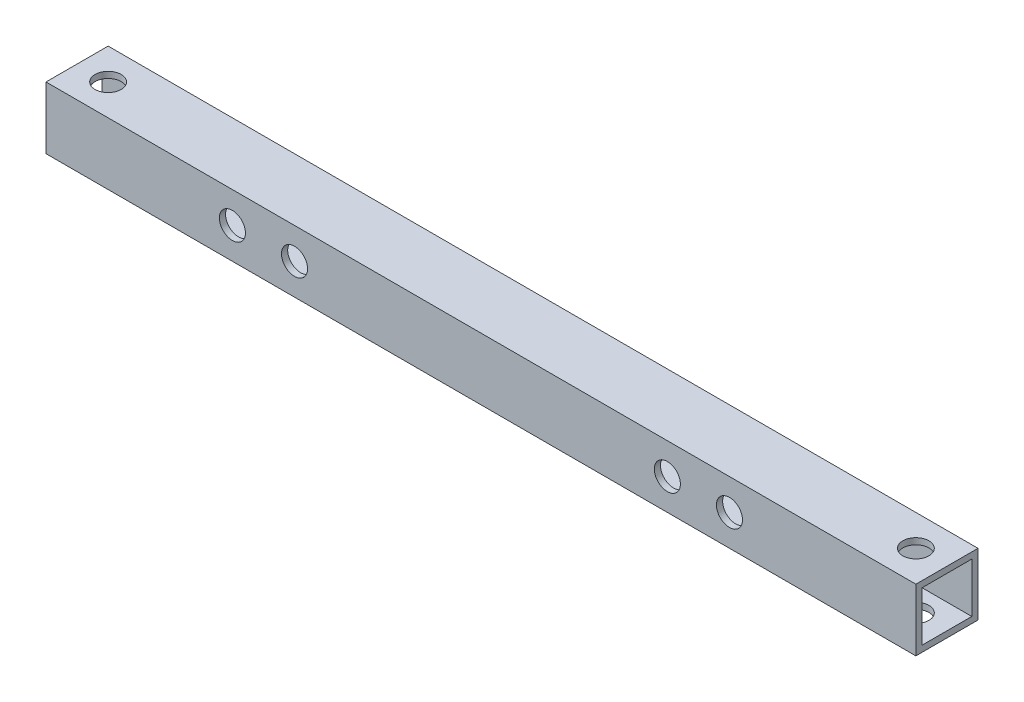
ISO-10303-21;
HEADER;
FILE_DESCRIPTION(('STEP AP214'),'2;1');
FILE_NAME('part.step','',(''),(''),'','','');
FILE_SCHEMA(('AUTOMOTIVE_DESIGN { 1 0 10303 214 1 1 1 1 }'));
ENDSEC;
DATA;
#1=APPLICATION_CONTEXT('core data for automotive mechanical design processes');
#2=APPLICATION_PROTOCOL_DEFINITION('international standard','automotive_design',2000,#1);
#3=PRODUCT_CONTEXT('',#1,'mechanical');
#4=PRODUCT('Part','Part','',(#3));
#5=PRODUCT_RELATED_PRODUCT_CATEGORY('part','',(#4));
#6=PRODUCT_DEFINITION_FORMATION('','',#4);
#7=PRODUCT_DEFINITION_CONTEXT('part definition',#1,'design');
#8=PRODUCT_DEFINITION('design','',#6,#7);
#9=PRODUCT_DEFINITION_SHAPE('','',#8);
#10=(LENGTH_UNIT() NAMED_UNIT(*) SI_UNIT(.MILLI.,.METRE.));
#11=(NAMED_UNIT(*) PLANE_ANGLE_UNIT() SI_UNIT($,.RADIAN.));
#12=(NAMED_UNIT(*) SI_UNIT($,.STERADIAN.) SOLID_ANGLE_UNIT());
#13=UNCERTAINTY_MEASURE_WITH_UNIT(LENGTH_MEASURE(1.E-05),#10,'distance_accuracy_value','');
#14=(GEOMETRIC_REPRESENTATION_CONTEXT(3) GLOBAL_UNCERTAINTY_ASSIGNED_CONTEXT((#13)) GLOBAL_UNIT_ASSIGNED_CONTEXT((#10,
#11,#12)) REPRESENTATION_CONTEXT('',''));
#15=CARTESIAN_POINT('',(0.,0.,0.));
#16=DIRECTION('',(0.,0.,1.));
#17=DIRECTION('',(1.,0.,0.));
#18=AXIS2_PLACEMENT_3D('',#15,#16,#17);
#19=CARTESIAN_POINT('',(140.,0.,0.));
#20=DIRECTION('',(1.,0.,0.));
#21=DIRECTION('',(0.,0.,-1.));
#22=AXIS2_PLACEMENT_3D('',#19,#20,#21);
#23=PLANE('',#22);
#24=DIRECTION('',(0.,1.,0.));
#25=VECTOR('',#24,1.);
#26=CARTESIAN_POINT('',(140.,5.,-5.));
#27=LINE('',#26,#25);
#28=CARTESIAN_POINT('',(140.,-5.,-5.));
#29=VERTEX_POINT('',#28);
#30=CARTESIAN_POINT('',(140.,5.,-5.));
#31=VERTEX_POINT('',#30);
#32=EDGE_CURVE('E163',#29,#31,#27,.T.);
#33=ORIENTED_EDGE('',*,*,#32,.T.);
#34=DIRECTION('',(0.,0.,1.));
#35=VECTOR('',#34,1.);
#36=CARTESIAN_POINT('',(140.,5.,5.));
#37=LINE('',#36,#35);
#38=CARTESIAN_POINT('',(140.,5.,5.));
#39=VERTEX_POINT('',#38);
#40=EDGE_CURVE('E166',#31,#39,#37,.T.);
#41=ORIENTED_EDGE('',*,*,#40,.T.);
#42=DIRECTION('',(0.,-1.,0.));
#43=VECTOR('',#42,1.);
#44=CARTESIAN_POINT('',(140.,5.,5.));
#45=LINE('',#44,#43);
#46=CARTESIAN_POINT('',(140.,-5.,5.));
#47=VERTEX_POINT('',#46);
#48=EDGE_CURVE('E169',#39,#47,#45,.T.);
#49=ORIENTED_EDGE('',*,*,#48,.T.);
#50=DIRECTION('',(0.,0.,-1.));
#51=VECTOR('',#50,1.);
#52=CARTESIAN_POINT('',(140.,-5.,5.));
#53=LINE('',#52,#51);
#54=EDGE_CURVE('E171',#47,#29,#53,.T.);
#55=ORIENTED_EDGE('',*,*,#54,.T.);
#56=EDGE_LOOP('',(#33,#41,#49,#55));
#57=FACE_BOUND('',#56,.T.);
#58=DIRECTION('',(0.,0.,1.));
#59=VECTOR('',#58,1.);
#60=CARTESIAN_POINT('',(140.,4.,5.));
#61=LINE('',#60,#59);
#62=CARTESIAN_POINT('',(140.,4.,-4.));
#63=VERTEX_POINT('',#62);
#64=CARTESIAN_POINT('',(140.,4.,4.));
#65=VERTEX_POINT('',#64);
#66=EDGE_CURVE('E133',#63,#65,#61,.T.);
#67=ORIENTED_EDGE('',*,*,#66,.F.);
#68=DIRECTION('',(0.,1.,0.));
#69=VECTOR('',#68,1.);
#70=CARTESIAN_POINT('',(140.,5.,-4.));
#71=LINE('',#70,#69);
#72=CARTESIAN_POINT('',(140.,-4.,-4.));
#73=VERTEX_POINT('',#72);
#74=EDGE_CURVE('E125',#73,#63,#71,.T.);
#75=ORIENTED_EDGE('',*,*,#74,.F.);
#76=DIRECTION('',(0.,0.,-1.));
#77=VECTOR('',#76,1.);
#78=CARTESIAN_POINT('',(140.,-4.,5.));
#79=LINE('',#78,#77);
#80=CARTESIAN_POINT('',(140.,-4.,4.));
#81=VERTEX_POINT('',#80);
#82=EDGE_CURVE('E147',#81,#73,#79,.T.);
#83=ORIENTED_EDGE('',*,*,#82,.F.);
#84=DIRECTION('',(0.,-1.,0.));
#85=VECTOR('',#84,1.);
#86=CARTESIAN_POINT('',(140.,5.,4.));
#87=LINE('',#86,#85);
#88=EDGE_CURVE('E145',#65,#81,#87,.T.);
#89=ORIENTED_EDGE('',*,*,#88,.F.);
#90=EDGE_LOOP('',(#67,#75,#83,#89));
#91=FACE_BOUND('',#90,.T.);
#92=ADVANCED_FACE('F58',(#57,#91),#23,.T.);
#93=CARTESIAN_POINT('',(0.,0.,0.));
#94=DIRECTION('',(1.,0.,0.));
#95=DIRECTION('',(0.,0.,-1.));
#96=AXIS2_PLACEMENT_3D('',#93,#94,#95);
#97=PLANE('',#96);
#98=DIRECTION('',(0.,1.,0.));
#99=VECTOR('',#98,1.);
#100=CARTESIAN_POINT('',(0.,5.,-5.));
#101=LINE('',#100,#99);
#102=CARTESIAN_POINT('',(0.,-5.,-5.));
#103=VERTEX_POINT('',#102);
#104=CARTESIAN_POINT('',(0.,5.,-5.));
#105=VERTEX_POINT('',#104);
#106=EDGE_CURVE('E141',#103,#105,#101,.T.);
#107=ORIENTED_EDGE('',*,*,#106,.F.);
#108=DIRECTION('',(0.,0.,-1.));
#109=VECTOR('',#108,1.);
#110=CARTESIAN_POINT('',(0.,-5.,5.));
#111=LINE('',#110,#109);
#112=CARTESIAN_POINT('',(0.,-5.,5.));
#113=VERTEX_POINT('',#112);
#114=EDGE_CURVE('E167',#113,#103,#111,.T.);
#115=ORIENTED_EDGE('',*,*,#114,.F.);
#116=DIRECTION('',(0.,-1.,0.));
#117=VECTOR('',#116,1.);
#118=CARTESIAN_POINT('',(0.,5.,5.));
#119=LINE('',#118,#117);
#120=CARTESIAN_POINT('',(0.,5.,5.));
#121=VERTEX_POINT('',#120);
#122=EDGE_CURVE('E178',#121,#113,#119,.T.);
#123=ORIENTED_EDGE('',*,*,#122,.F.);
#124=DIRECTION('',(0.,0.,1.));
#125=VECTOR('',#124,1.);
#126=CARTESIAN_POINT('',(0.,5.,5.));
#127=LINE('',#126,#125);
#128=EDGE_CURVE('E176',#105,#121,#127,.T.);
#129=ORIENTED_EDGE('',*,*,#128,.F.);
#130=EDGE_LOOP('',(#107,#115,#123,#129));
#131=FACE_BOUND('',#130,.T.);
#132=DIRECTION('',(0.,1.,0.));
#133=VECTOR('',#132,1.);
#134=CARTESIAN_POINT('',(0.,5.,-4.));
#135=LINE('',#134,#133);
#136=CARTESIAN_POINT('',(0.,-4.,-4.));
#137=VERTEX_POINT('',#136);
#138=CARTESIAN_POINT('',(0.,4.,-4.));
#139=VERTEX_POINT('',#138);
#140=EDGE_CURVE('E83',#137,#139,#135,.T.);
#141=ORIENTED_EDGE('',*,*,#140,.T.);
#142=DIRECTION('',(0.,0.,1.));
#143=VECTOR('',#142,1.);
#144=CARTESIAN_POINT('',(0.,4.,5.));
#145=LINE('',#144,#143);
#146=CARTESIAN_POINT('',(0.,4.,4.));
#147=VERTEX_POINT('',#146);
#148=EDGE_CURVE('E140',#139,#147,#145,.T.);
#149=ORIENTED_EDGE('',*,*,#148,.T.);
#150=DIRECTION('',(0.,-1.,0.));
#151=VECTOR('',#150,1.);
#152=CARTESIAN_POINT('',(0.,5.,4.));
#153=LINE('',#152,#151);
#154=CARTESIAN_POINT('',(0.,-4.,4.));
#155=VERTEX_POINT('',#154);
#156=EDGE_CURVE('E155',#147,#155,#153,.T.);
#157=ORIENTED_EDGE('',*,*,#156,.T.);
#158=DIRECTION('',(0.,0.,-1.));
#159=VECTOR('',#158,1.);
#160=CARTESIAN_POINT('',(0.,-4.,5.));
#161=LINE('',#160,#159);
#162=EDGE_CURVE('E134',#155,#137,#161,.T.);
#163=ORIENTED_EDGE('',*,*,#162,.T.);
#164=EDGE_LOOP('',(#141,#149,#157,#163));
#165=FACE_BOUND('',#164,.T.);
#166=ADVANCED_FACE('F267',(#131,#165),#97,.F.);
#167=CARTESIAN_POINT('',(140.,5.,-5.));
#168=DIRECTION('',(0.,0.,1.));
#169=DIRECTION('',(0.,-1.,0.));
#170=AXIS2_PLACEMENT_3D('',#167,#168,#169);
#171=PLANE('',#170);
#172=CARTESIAN_POINT('',(30.,0.,-5.));
#173=DIRECTION('',(0.,0.,1.));
#174=DIRECTION('',(1.,0.,0.));
#175=AXIS2_PLACEMENT_3D('',#172,#173,#174);
#176=CIRCLE('',#175,2.1);
#177=CARTESIAN_POINT('',(32.1,0.,-5.));
#178=VERTEX_POINT('',#177);
#179=EDGE_CURVE('E307',#178,#178,#176,.T.);
#180=ORIENTED_EDGE('',*,*,#179,.T.);
#181=EDGE_LOOP('',(#180));
#182=FACE_BOUND('',#181,.T.);
#183=CARTESIAN_POINT('',(110.,0.,-5.));
#184=DIRECTION('',(0.,0.,1.));
#185=DIRECTION('',(-1.,0.,0.));
#186=AXIS2_PLACEMENT_3D('',#183,#184,#185);
#187=CIRCLE('',#186,2.09999999999999);
#188=CARTESIAN_POINT('',(107.9,0.,-5.));
#189=VERTEX_POINT('',#188);
#190=EDGE_CURVE('E314',#189,#189,#187,.T.);
#191=ORIENTED_EDGE('',*,*,#190,.T.);
#192=EDGE_LOOP('',(#191));
#193=FACE_BOUND('',#192,.T.);
#194=CARTESIAN_POINT('',(100.,0.,-5.));
#195=DIRECTION('',(0.,0.,1.));
#196=DIRECTION('',(-1.,0.,0.));
#197=AXIS2_PLACEMENT_3D('',#194,#195,#196);
#198=CIRCLE('',#197,2.09999999999999);
#199=CARTESIAN_POINT('',(97.9,0.,-5.));
#200=VERTEX_POINT('',#199);
#201=EDGE_CURVE('E315',#200,#200,#198,.T.);
#202=ORIENTED_EDGE('',*,*,#201,.T.);
#203=EDGE_LOOP('',(#202));
#204=FACE_BOUND('',#203,.T.);
#205=CARTESIAN_POINT('',(40.,0.,-5.));
#206=DIRECTION('',(0.,0.,1.));
#207=DIRECTION('',(1.,0.,0.));
#208=AXIS2_PLACEMENT_3D('',#205,#206,#207);
#209=CIRCLE('',#208,2.1);
#210=CARTESIAN_POINT('',(42.1,0.,-5.));
#211=VERTEX_POINT('',#210);
#212=EDGE_CURVE('E200',#211,#211,#209,.T.);
#213=ORIENTED_EDGE('',*,*,#212,.T.);
#214=EDGE_LOOP('',(#213));
#215=FACE_BOUND('',#214,.T.);
#216=ORIENTED_EDGE('',*,*,#106,.T.);
#217=DIRECTION('',(-1.,0.,0.));
#218=VECTOR('',#217,1.);
#219=CARTESIAN_POINT('',(140.,5.,-5.));
#220=LINE('',#219,#218);
#221=EDGE_CURVE('E12',#31,#105,#220,.T.);
#222=ORIENTED_EDGE('',*,*,#221,.F.);
#223=ORIENTED_EDGE('',*,*,#32,.F.);
#224=DIRECTION('',(-1.,0.,0.));
#225=VECTOR('',#224,1.);
#226=CARTESIAN_POINT('',(140.,-5.,-5.));
#227=LINE('',#226,#225);
#228=EDGE_CURVE('E173',#29,#103,#227,.T.);
#229=ORIENTED_EDGE('',*,*,#228,.T.);
#230=EDGE_LOOP('',(#216,#222,#223,#229));
#231=FACE_BOUND('',#230,.T.);
#232=ADVANCED_FACE('F60',(#182,#193,#204,#215,#231),#171,.F.);
#233=CARTESIAN_POINT('',(140.,5.,5.));
#234=DIRECTION('',(0.,-1.,0.));
#235=DIRECTION('',(0.,0.,-1.));
#236=AXIS2_PLACEMENT_3D('',#233,#234,#235);
#237=PLANE('',#236);
#238=CARTESIAN_POINT('',(5.,5.,0.));
#239=DIRECTION('',(0.,1.,0.));
#240=DIRECTION('',(0.,0.,1.));
#241=AXIS2_PLACEMENT_3D('',#238,#239,#240);
#242=CIRCLE('',#241,2.1);
#243=CARTESIAN_POINT('',(5.,5.,2.1));
#244=VERTEX_POINT('',#243);
#245=EDGE_CURVE('E224',#244,#244,#242,.T.);
#246=ORIENTED_EDGE('',*,*,#245,.F.);
#247=EDGE_LOOP('',(#246));
#248=FACE_BOUND('',#247,.T.);
#249=CARTESIAN_POINT('',(135.,5.,0.));
#250=DIRECTION('',(0.,1.,0.));
#251=DIRECTION('',(0.,0.,-1.));
#252=AXIS2_PLACEMENT_3D('',#249,#250,#251);
#253=CIRCLE('',#252,2.10000000000002);
#254=CARTESIAN_POINT('',(135.,5.,-2.10000000000004));
#255=VERTEX_POINT('',#254);
#256=EDGE_CURVE('E221',#255,#255,#253,.T.);
#257=ORIENTED_EDGE('',*,*,#256,.F.);
#258=EDGE_LOOP('',(#257));
#259=FACE_BOUND('',#258,.T.);
#260=ORIENTED_EDGE('',*,*,#128,.T.);
#261=DIRECTION('',(-1.,0.,0.));
#262=VECTOR('',#261,1.);
#263=CARTESIAN_POINT('',(140.,5.,5.));
#264=LINE('',#263,#262);
#265=EDGE_CURVE('E67',#39,#121,#264,.T.);
#266=ORIENTED_EDGE('',*,*,#265,.F.);
#267=ORIENTED_EDGE('',*,*,#40,.F.);
#268=ORIENTED_EDGE('',*,*,#221,.T.);
#269=EDGE_LOOP('',(#260,#266,#267,#268));
#270=FACE_BOUND('',#269,.T.);
#271=ADVANCED_FACE('F253',(#248,#259,#270),#237,.F.);
#272=CARTESIAN_POINT('',(140.,5.,5.));
#273=DIRECTION('',(0.,0.,-1.));
#274=DIRECTION('',(0.,1.,0.));
#275=AXIS2_PLACEMENT_3D('',#272,#273,#274);
#276=PLANE('',#275);
#277=CARTESIAN_POINT('',(30.,0.,5.));
#278=DIRECTION('',(0.,0.,1.));
#279=DIRECTION('',(1.,0.,0.));
#280=AXIS2_PLACEMENT_3D('',#277,#278,#279);
#281=CIRCLE('',#280,2.1);
#282=CARTESIAN_POINT('',(32.1,0.,5.));
#283=VERTEX_POINT('',#282);
#284=EDGE_CURVE('E294',#283,#283,#281,.T.);
#285=ORIENTED_EDGE('',*,*,#284,.F.);
#286=EDGE_LOOP('',(#285));
#287=FACE_BOUND('',#286,.T.);
#288=CARTESIAN_POINT('',(110.,0.,5.));
#289=DIRECTION('',(0.,0.,1.));
#290=DIRECTION('',(-1.,0.,0.));
#291=AXIS2_PLACEMENT_3D('',#288,#289,#290);
#292=CIRCLE('',#291,2.09999999999999);
#293=CARTESIAN_POINT('',(107.9,0.,5.));
#294=VERTEX_POINT('',#293);
#295=EDGE_CURVE('E298',#294,#294,#292,.T.);
#296=ORIENTED_EDGE('',*,*,#295,.F.);
#297=EDGE_LOOP('',(#296));
#298=FACE_BOUND('',#297,.T.);
#299=CARTESIAN_POINT('',(100.,0.,5.));
#300=DIRECTION('',(0.,0.,1.));
#301=DIRECTION('',(-1.,0.,0.));
#302=AXIS2_PLACEMENT_3D('',#299,#300,#301);
#303=CIRCLE('',#302,2.09999999999999);
#304=CARTESIAN_POINT('',(97.9,0.,5.));
#305=VERTEX_POINT('',#304);
#306=EDGE_CURVE('E302',#305,#305,#303,.T.);
#307=ORIENTED_EDGE('',*,*,#306,.F.);
#308=EDGE_LOOP('',(#307));
#309=FACE_BOUND('',#308,.T.);
#310=CARTESIAN_POINT('',(40.,0.,5.));
#311=DIRECTION('',(0.,0.,1.));
#312=DIRECTION('',(1.,0.,0.));
#313=AXIS2_PLACEMENT_3D('',#310,#311,#312);
#314=CIRCLE('',#313,2.1);
#315=CARTESIAN_POINT('',(42.1,0.,5.));
#316=VERTEX_POINT('',#315);
#317=EDGE_CURVE('E305',#316,#316,#314,.T.);
#318=ORIENTED_EDGE('',*,*,#317,.F.);
#319=EDGE_LOOP('',(#318));
#320=FACE_BOUND('',#319,.T.);
#321=ORIENTED_EDGE('',*,*,#122,.T.);
#322=DIRECTION('',(-1.,0.,0.));
#323=VECTOR('',#322,1.);
#324=CARTESIAN_POINT('',(140.,-5.,5.));
#325=LINE('',#324,#323);
#326=EDGE_CURVE('E183',#47,#113,#325,.T.);
#327=ORIENTED_EDGE('',*,*,#326,.F.);
#328=ORIENTED_EDGE('',*,*,#48,.F.);
#329=ORIENTED_EDGE('',*,*,#265,.T.);
#330=EDGE_LOOP('',(#321,#327,#328,#329));
#331=FACE_BOUND('',#330,.T.);
#332=ADVANCED_FACE('F256',(#287,#298,#309,#320,#331),#276,.F.);
#333=CARTESIAN_POINT('',(140.,-5.,5.));
#334=DIRECTION('',(0.,1.,0.));
#335=DIRECTION('',(0.,0.,1.));
#336=AXIS2_PLACEMENT_3D('',#333,#334,#335);
#337=PLANE('',#336);
#338=CARTESIAN_POINT('',(5.,-5.,0.));
#339=DIRECTION('',(0.,1.,0.));
#340=DIRECTION('',(0.,0.,1.));
#341=AXIS2_PLACEMENT_3D('',#338,#339,#340);
#342=CIRCLE('',#341,2.1);
#343=CARTESIAN_POINT('',(5.,-5.,2.1));
#344=VERTEX_POINT('',#343);
#345=EDGE_CURVE('E192',#344,#344,#342,.T.);
#346=ORIENTED_EDGE('',*,*,#345,.T.);
#347=EDGE_LOOP('',(#346));
#348=FACE_BOUND('',#347,.T.);
#349=CARTESIAN_POINT('',(135.,-5.,0.));
#350=DIRECTION('',(0.,1.,0.));
#351=DIRECTION('',(0.,0.,-1.));
#352=AXIS2_PLACEMENT_3D('',#349,#350,#351);
#353=CIRCLE('',#352,2.10000000000002);
#354=CARTESIAN_POINT('',(135.,-5.,-2.10000000000004));
#355=VERTEX_POINT('',#354);
#356=EDGE_CURVE('E227',#355,#355,#353,.T.);
#357=ORIENTED_EDGE('',*,*,#356,.T.);
#358=EDGE_LOOP('',(#357));
#359=FACE_BOUND('',#358,.T.);
#360=ORIENTED_EDGE('',*,*,#114,.T.);
#361=ORIENTED_EDGE('',*,*,#228,.F.);
#362=ORIENTED_EDGE('',*,*,#54,.F.);
#363=ORIENTED_EDGE('',*,*,#326,.T.);
#364=EDGE_LOOP('',(#360,#361,#362,#363));
#365=FACE_BOUND('',#364,.T.);
#366=ADVANCED_FACE('F271',(#348,#359,#365),#337,.F.);
#367=CARTESIAN_POINT('',(140.,5.,-4.));
#368=DIRECTION('',(0.,0.,1.));
#369=DIRECTION('',(0.,-1.,0.));
#370=AXIS2_PLACEMENT_3D('',#367,#368,#369);
#371=PLANE('',#370);
#372=CARTESIAN_POINT('',(30.,0.,-4.));
#373=DIRECTION('',(0.,0.,1.));
#374=DIRECTION('',(0.,-1.,0.));
#375=AXIS2_PLACEMENT_3D('',#372,#373,#374);
#376=CIRCLE('',#375,2.1);
#377=CARTESIAN_POINT('',(30.,-2.1,-4.));
#378=VERTEX_POINT('',#377);
#379=EDGE_CURVE('E218',#378,#378,#376,.T.);
#380=ORIENTED_EDGE('',*,*,#379,.F.);
#381=EDGE_LOOP('',(#380));
#382=FACE_BOUND('',#381,.T.);
#383=CARTESIAN_POINT('',(110.,0.,-4.));
#384=DIRECTION('',(0.,0.,1.));
#385=DIRECTION('',(0.,-1.,0.));
#386=AXIS2_PLACEMENT_3D('',#383,#384,#385);
#387=CIRCLE('',#386,2.09999999999999);
#388=CARTESIAN_POINT('',(110.,-2.09999999999998,-4.));
#389=VERTEX_POINT('',#388);
#390=EDGE_CURVE('E206',#389,#389,#387,.T.);
#391=ORIENTED_EDGE('',*,*,#390,.F.);
#392=EDGE_LOOP('',(#391));
#393=FACE_BOUND('',#392,.T.);
#394=CARTESIAN_POINT('',(100.,0.,-4.));
#395=DIRECTION('',(0.,0.,1.));
#396=DIRECTION('',(0.,-1.,0.));
#397=AXIS2_PLACEMENT_3D('',#394,#395,#396);
#398=CIRCLE('',#397,2.09999999999999);
#399=CARTESIAN_POINT('',(100.,-2.09999999999998,-4.));
#400=VERTEX_POINT('',#399);
#401=EDGE_CURVE('E203',#400,#400,#398,.T.);
#402=ORIENTED_EDGE('',*,*,#401,.F.);
#403=EDGE_LOOP('',(#402));
#404=FACE_BOUND('',#403,.T.);
#405=CARTESIAN_POINT('',(40.,0.,-4.));
#406=DIRECTION('',(0.,0.,1.));
#407=DIRECTION('',(0.,-1.,0.));
#408=AXIS2_PLACEMENT_3D('',#405,#406,#407);
#409=CIRCLE('',#408,2.1);
#410=CARTESIAN_POINT('',(40.,-2.1,-4.));
#411=VERTEX_POINT('',#410);
#412=EDGE_CURVE('E199',#411,#411,#409,.T.);
#413=ORIENTED_EDGE('',*,*,#412,.F.);
#414=EDGE_LOOP('',(#413));
#415=FACE_BOUND('',#414,.T.);
#416=ORIENTED_EDGE('',*,*,#140,.F.);
#417=DIRECTION('',(-1.,0.,0.));
#418=VECTOR('',#417,1.);
#419=CARTESIAN_POINT('',(140.,-4.,-4.));
#420=LINE('',#419,#418);
#421=EDGE_CURVE('E129',#73,#137,#420,.T.);
#422=ORIENTED_EDGE('',*,*,#421,.F.);
#423=ORIENTED_EDGE('',*,*,#74,.T.);
#424=DIRECTION('',(-1.,0.,0.));
#425=VECTOR('',#424,1.);
#426=CARTESIAN_POINT('',(140.,4.,-4.));
#427=LINE('',#426,#425);
#428=EDGE_CURVE('E128',#63,#139,#427,.T.);
#429=ORIENTED_EDGE('',*,*,#428,.T.);
#430=EDGE_LOOP('',(#416,#422,#423,#429));
#431=FACE_BOUND('',#430,.T.);
#432=ADVANCED_FACE('F127',(#382,#393,#404,#415,#431),#371,.T.);
#433=CARTESIAN_POINT('',(140.,4.,5.));
#434=DIRECTION('',(0.,-1.,0.));
#435=DIRECTION('',(0.,0.,-1.));
#436=AXIS2_PLACEMENT_3D('',#433,#434,#435);
#437=PLANE('',#436);
#438=CARTESIAN_POINT('',(5.,4.,0.));
#439=DIRECTION('',(0.,-1.,0.));
#440=DIRECTION('',(0.,0.,-1.));
#441=AXIS2_PLACEMENT_3D('',#438,#439,#440);
#442=CIRCLE('',#441,2.1);
#443=CARTESIAN_POINT('',(5.,4.,-2.1));
#444=VERTEX_POINT('',#443);
#445=EDGE_CURVE('E153',#444,#444,#442,.T.);
#446=ORIENTED_EDGE('',*,*,#445,.F.);
#447=EDGE_LOOP('',(#446));
#448=FACE_BOUND('',#447,.T.);
#449=CARTESIAN_POINT('',(135.,4.,0.));
#450=DIRECTION('',(0.,-1.,0.));
#451=DIRECTION('',(0.,0.,-1.));
#452=AXIS2_PLACEMENT_3D('',#449,#450,#451);
#453=CIRCLE('',#452,2.10000000000002);
#454=CARTESIAN_POINT('',(135.,4.,-2.10000000000004));
#455=VERTEX_POINT('',#454);
#456=EDGE_CURVE('E191',#455,#455,#453,.T.);
#457=ORIENTED_EDGE('',*,*,#456,.F.);
#458=EDGE_LOOP('',(#457));
#459=FACE_BOUND('',#458,.T.);
#460=ORIENTED_EDGE('',*,*,#148,.F.);
#461=ORIENTED_EDGE('',*,*,#428,.F.);
#462=ORIENTED_EDGE('',*,*,#66,.T.);
#463=DIRECTION('',(-1.,0.,0.));
#464=VECTOR('',#463,1.);
#465=CARTESIAN_POINT('',(140.,4.,4.));
#466=LINE('',#465,#464);
#467=EDGE_CURVE('E142',#65,#147,#466,.T.);
#468=ORIENTED_EDGE('',*,*,#467,.T.);
#469=EDGE_LOOP('',(#460,#461,#462,#468));
#470=FACE_BOUND('',#469,.T.);
#471=ADVANCED_FACE('F137',(#448,#459,#470),#437,.T.);
#472=CARTESIAN_POINT('',(140.,5.,4.));
#473=DIRECTION('',(0.,0.,-1.));
#474=DIRECTION('',(0.,1.,0.));
#475=AXIS2_PLACEMENT_3D('',#472,#473,#474);
#476=PLANE('',#475);
#477=CARTESIAN_POINT('',(30.,0.,4.));
#478=DIRECTION('',(0.,0.,-1.));
#479=DIRECTION('',(0.,1.,0.));
#480=AXIS2_PLACEMENT_3D('',#477,#478,#479);
#481=CIRCLE('',#480,2.1);
#482=CARTESIAN_POINT('',(30.,2.1,4.));
#483=VERTEX_POINT('',#482);
#484=EDGE_CURVE('E62',#483,#483,#481,.T.);
#485=ORIENTED_EDGE('',*,*,#484,.F.);
#486=EDGE_LOOP('',(#485));
#487=FACE_BOUND('',#486,.T.);
#488=CARTESIAN_POINT('',(110.,0.,4.));
#489=DIRECTION('',(0.,0.,-1.));
#490=DIRECTION('',(0.,1.,0.));
#491=AXIS2_PLACEMENT_3D('',#488,#489,#490);
#492=CIRCLE('',#491,2.09999999999999);
#493=CARTESIAN_POINT('',(110.,2.1,4.));
#494=VERTEX_POINT('',#493);
#495=EDGE_CURVE('E204',#494,#494,#492,.T.);
#496=ORIENTED_EDGE('',*,*,#495,.F.);
#497=EDGE_LOOP('',(#496));
#498=FACE_BOUND('',#497,.T.);
#499=CARTESIAN_POINT('',(100.,0.,4.));
#500=DIRECTION('',(0.,0.,-1.));
#501=DIRECTION('',(0.,1.,0.));
#502=AXIS2_PLACEMENT_3D('',#499,#500,#501);
#503=CIRCLE('',#502,2.09999999999999);
#504=CARTESIAN_POINT('',(100.,2.1,4.));
#505=VERTEX_POINT('',#504);
#506=EDGE_CURVE('E201',#505,#505,#503,.T.);
#507=ORIENTED_EDGE('',*,*,#506,.F.);
#508=EDGE_LOOP('',(#507));
#509=FACE_BOUND('',#508,.T.);
#510=CARTESIAN_POINT('',(40.,0.,4.));
#511=DIRECTION('',(0.,0.,-1.));
#512=DIRECTION('',(0.,1.,0.));
#513=AXIS2_PLACEMENT_3D('',#510,#511,#512);
#514=CIRCLE('',#513,2.1);
#515=CARTESIAN_POINT('',(40.,2.1,4.));
#516=VERTEX_POINT('',#515);
#517=EDGE_CURVE('E196',#516,#516,#514,.T.);
#518=ORIENTED_EDGE('',*,*,#517,.F.);
#519=EDGE_LOOP('',(#518));
#520=FACE_BOUND('',#519,.T.);
#521=ORIENTED_EDGE('',*,*,#156,.F.);
#522=ORIENTED_EDGE('',*,*,#467,.F.);
#523=ORIENTED_EDGE('',*,*,#88,.T.);
#524=DIRECTION('',(-1.,0.,0.));
#525=VECTOR('',#524,1.);
#526=CARTESIAN_POINT('',(140.,-4.,4.));
#527=LINE('',#526,#525);
#528=EDGE_CURVE('E75',#81,#155,#527,.T.);
#529=ORIENTED_EDGE('',*,*,#528,.T.);
#530=EDGE_LOOP('',(#521,#522,#523,#529));
#531=FACE_BOUND('',#530,.T.);
#532=ADVANCED_FACE('F241',(#487,#498,#509,#520,#531),#476,.T.);
#533=CARTESIAN_POINT('',(140.,-4.,5.));
#534=DIRECTION('',(0.,1.,0.));
#535=DIRECTION('',(0.,0.,1.));
#536=AXIS2_PLACEMENT_3D('',#533,#534,#535);
#537=PLANE('',#536);
#538=CARTESIAN_POINT('',(5.,-4.,0.));
#539=DIRECTION('',(0.,1.,0.));
#540=DIRECTION('',(0.,0.,1.));
#541=AXIS2_PLACEMENT_3D('',#538,#539,#540);
#542=CIRCLE('',#541,2.1);
#543=CARTESIAN_POINT('',(5.,-4.,2.1));
#544=VERTEX_POINT('',#543);
#545=EDGE_CURVE('E193',#544,#544,#542,.T.);
#546=ORIENTED_EDGE('',*,*,#545,.F.);
#547=EDGE_LOOP('',(#546));
#548=FACE_BOUND('',#547,.T.);
#549=CARTESIAN_POINT('',(135.,-4.,0.));
#550=DIRECTION('',(0.,1.,0.));
#551=DIRECTION('',(0.,0.,1.));
#552=AXIS2_PLACEMENT_3D('',#549,#550,#551);
#553=CIRCLE('',#552,2.10000000000002);
#554=CARTESIAN_POINT('',(135.,-4.,2.1));
#555=VERTEX_POINT('',#554);
#556=EDGE_CURVE('E188',#555,#555,#553,.T.);
#557=ORIENTED_EDGE('',*,*,#556,.F.);
#558=EDGE_LOOP('',(#557));
#559=FACE_BOUND('',#558,.T.);
#560=ORIENTED_EDGE('',*,*,#162,.F.);
#561=ORIENTED_EDGE('',*,*,#528,.F.);
#562=ORIENTED_EDGE('',*,*,#82,.T.);
#563=ORIENTED_EDGE('',*,*,#421,.T.);
#564=EDGE_LOOP('',(#560,#561,#562,#563));
#565=FACE_BOUND('',#564,.T.);
#566=ADVANCED_FACE('F356',(#548,#559,#565),#537,.T.);
#567=CARTESIAN_POINT('',(135.,-5.,0.));
#568=DIRECTION('',(0.,1.,0.));
#569=DIRECTION('',(0.,0.,1.));
#570=AXIS2_PLACEMENT_3D('',#567,#568,#569);
#571=CYLINDRICAL_SURFACE('',#570,2.10000000000002);
#572=ORIENTED_EDGE('',*,*,#556,.T.);
#573=EDGE_LOOP('',(#572));
#574=FACE_BOUND('',#573,.T.);
#575=ORIENTED_EDGE('',*,*,#356,.F.);
#576=EDGE_LOOP('',(#575));
#577=FACE_BOUND('',#576,.T.);
#578=ADVANCED_FACE('F250',(#574,#577),#571,.F.);
#579=CARTESIAN_POINT('',(5.,-5.,0.));
#580=DIRECTION('',(0.,1.,0.));
#581=DIRECTION('',(0.,0.,1.));
#582=AXIS2_PLACEMENT_3D('',#579,#580,#581);
#583=CYLINDRICAL_SURFACE('',#582,2.1);
#584=ORIENTED_EDGE('',*,*,#545,.T.);
#585=EDGE_LOOP('',(#584));
#586=FACE_BOUND('',#585,.T.);
#587=ORIENTED_EDGE('',*,*,#345,.F.);
#588=EDGE_LOOP('',(#587));
#589=FACE_BOUND('',#588,.T.);
#590=ADVANCED_FACE('F248',(#586,#589),#583,.F.);
#591=ORIENTED_EDGE('',*,*,#456,.T.);
#592=EDGE_LOOP('',(#591));
#593=FACE_BOUND('',#592,.T.);
#594=ORIENTED_EDGE('',*,*,#256,.T.);
#595=EDGE_LOOP('',(#594));
#596=FACE_BOUND('',#595,.T.);
#597=ADVANCED_FACE('F245',(#593,#596),#571,.F.);
#598=ORIENTED_EDGE('',*,*,#445,.T.);
#599=EDGE_LOOP('',(#598));
#600=FACE_BOUND('',#599,.T.);
#601=ORIENTED_EDGE('',*,*,#245,.T.);
#602=EDGE_LOOP('',(#601));
#603=FACE_BOUND('',#602,.T.);
#604=ADVANCED_FACE('F236',(#600,#603),#583,.F.);
#605=CARTESIAN_POINT('',(40.,0.,-5.));
#606=DIRECTION('',(0.,0.,1.));
#607=DIRECTION('',(1.,0.,0.));
#608=AXIS2_PLACEMENT_3D('',#605,#606,#607);
#609=CYLINDRICAL_SURFACE('',#608,2.1);
#610=ORIENTED_EDGE('',*,*,#517,.T.);
#611=EDGE_LOOP('',(#610));
#612=FACE_BOUND('',#611,.T.);
#613=ORIENTED_EDGE('',*,*,#317,.T.);
#614=EDGE_LOOP('',(#613));
#615=FACE_BOUND('',#614,.T.);
#616=ADVANCED_FACE('F342',(#612,#615),#609,.F.);
#617=CARTESIAN_POINT('',(100.,0.,-5.));
#618=DIRECTION('',(0.,0.,1.));
#619=DIRECTION('',(1.,0.,0.));
#620=AXIS2_PLACEMENT_3D('',#617,#618,#619);
#621=CYLINDRICAL_SURFACE('',#620,2.09999999999999);
#622=ORIENTED_EDGE('',*,*,#506,.T.);
#623=EDGE_LOOP('',(#622));
#624=FACE_BOUND('',#623,.T.);
#625=ORIENTED_EDGE('',*,*,#306,.T.);
#626=EDGE_LOOP('',(#625));
#627=FACE_BOUND('',#626,.T.);
#628=ADVANCED_FACE('F330',(#624,#627),#621,.F.);
#629=CARTESIAN_POINT('',(110.,0.,-5.));
#630=DIRECTION('',(0.,0.,1.));
#631=DIRECTION('',(1.,0.,0.));
#632=AXIS2_PLACEMENT_3D('',#629,#630,#631);
#633=CYLINDRICAL_SURFACE('',#632,2.09999999999999);
#634=ORIENTED_EDGE('',*,*,#495,.T.);
#635=EDGE_LOOP('',(#634));
#636=FACE_BOUND('',#635,.T.);
#637=ORIENTED_EDGE('',*,*,#295,.T.);
#638=EDGE_LOOP('',(#637));
#639=FACE_BOUND('',#638,.T.);
#640=ADVANCED_FACE('F338',(#636,#639),#633,.F.);
#641=CARTESIAN_POINT('',(30.,0.,-5.));
#642=DIRECTION('',(0.,0.,1.));
#643=DIRECTION('',(1.,0.,0.));
#644=AXIS2_PLACEMENT_3D('',#641,#642,#643);
#645=CYLINDRICAL_SURFACE('',#644,2.1);
#646=ORIENTED_EDGE('',*,*,#484,.T.);
#647=EDGE_LOOP('',(#646));
#648=FACE_BOUND('',#647,.T.);
#649=ORIENTED_EDGE('',*,*,#284,.T.);
#650=EDGE_LOOP('',(#649));
#651=FACE_BOUND('',#650,.T.);
#652=ADVANCED_FACE('F339',(#648,#651),#645,.F.);
#653=ORIENTED_EDGE('',*,*,#412,.T.);
#654=EDGE_LOOP('',(#653));
#655=FACE_BOUND('',#654,.T.);
#656=ORIENTED_EDGE('',*,*,#212,.F.);
#657=EDGE_LOOP('',(#656));
#658=FACE_BOUND('',#657,.T.);
#659=ADVANCED_FACE('F328',(#655,#658),#609,.F.);
#660=ORIENTED_EDGE('',*,*,#401,.T.);
#661=EDGE_LOOP('',(#660));
#662=FACE_BOUND('',#661,.T.);
#663=ORIENTED_EDGE('',*,*,#201,.F.);
#664=EDGE_LOOP('',(#663));
#665=FACE_BOUND('',#664,.T.);
#666=ADVANCED_FACE('F325',(#662,#665),#621,.F.);
#667=ORIENTED_EDGE('',*,*,#390,.T.);
#668=EDGE_LOOP('',(#667));
#669=FACE_BOUND('',#668,.T.);
#670=ORIENTED_EDGE('',*,*,#190,.F.);
#671=EDGE_LOOP('',(#670));
#672=FACE_BOUND('',#671,.T.);
#673=ADVANCED_FACE('F327',(#669,#672),#633,.F.);
#674=ORIENTED_EDGE('',*,*,#379,.T.);
#675=EDGE_LOOP('',(#674));
#676=FACE_BOUND('',#675,.T.);
#677=ORIENTED_EDGE('',*,*,#179,.F.);
#678=EDGE_LOOP('',(#677));
#679=FACE_BOUND('',#678,.T.);
#680=ADVANCED_FACE('F335',(#676,#679),#645,.F.);
#681=CLOSED_SHELL('',(#92,#166,#232,#271,#332,#366,#432,#471,#532,#566,#578,#590,#597,#604,#616,
#628,#640,#652,#659,#666,#673,#680));
#682=MANIFOLD_SOLID_BREP('B2',#681);
#683=ADVANCED_BREP_SHAPE_REPRESENTATION('',(#18,#682),#14);
#684=SHAPE_DEFINITION_REPRESENTATION(#9,#683);
ENDSEC;
END-ISO-10303-21;
